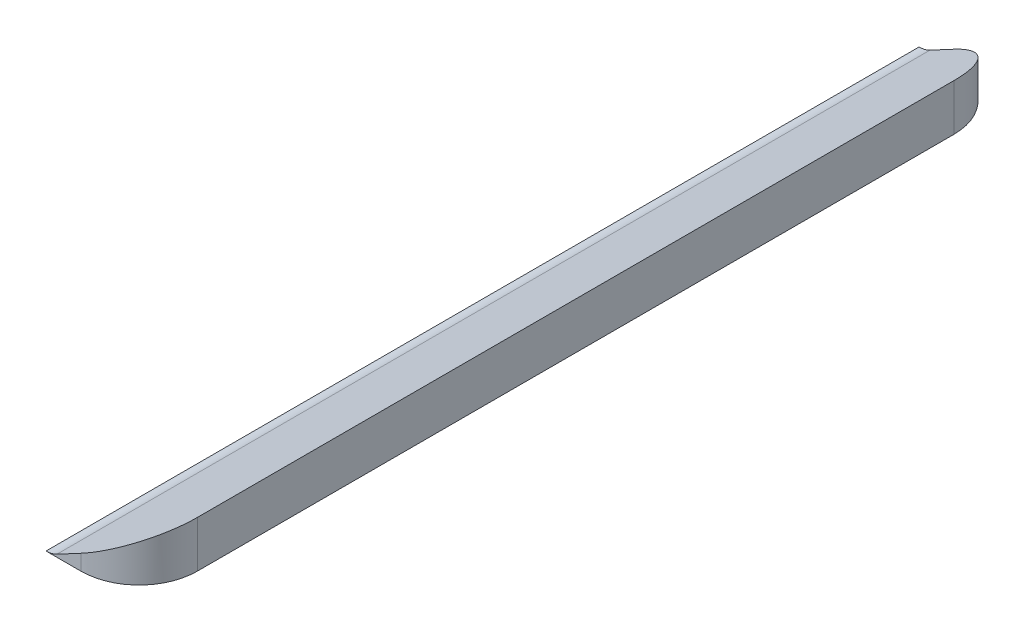
ISO-10303-21;
HEADER;
FILE_DESCRIPTION(('STEP AP214'),'2;1');
FILE_NAME('part.step','',(''),(''),'','','');
FILE_SCHEMA(('AUTOMOTIVE_DESIGN { 1 0 10303 214 1 1 1 1 }'));
ENDSEC;
DATA;
#1=APPLICATION_CONTEXT('core data for automotive mechanical design processes');
#2=APPLICATION_PROTOCOL_DEFINITION('international standard','automotive_design',2000,#1);
#3=PRODUCT_CONTEXT('',#1,'mechanical');
#4=PRODUCT('Part','Part','',(#3));
#5=PRODUCT_RELATED_PRODUCT_CATEGORY('part','',(#4));
#6=PRODUCT_DEFINITION_FORMATION('','',#4);
#7=PRODUCT_DEFINITION_CONTEXT('part definition',#1,'design');
#8=PRODUCT_DEFINITION('design','',#6,#7);
#9=PRODUCT_DEFINITION_SHAPE('','',#8);
#10=(LENGTH_UNIT() NAMED_UNIT(*) SI_UNIT(.MILLI.,.METRE.));
#11=(NAMED_UNIT(*) PLANE_ANGLE_UNIT() SI_UNIT($,.RADIAN.));
#12=(NAMED_UNIT(*) SI_UNIT($,.STERADIAN.) SOLID_ANGLE_UNIT());
#13=UNCERTAINTY_MEASURE_WITH_UNIT(LENGTH_MEASURE(1.E-05),#10,'distance_accuracy_value','');
#14=(GEOMETRIC_REPRESENTATION_CONTEXT(3) GLOBAL_UNCERTAINTY_ASSIGNED_CONTEXT((#13)) GLOBAL_UNIT_ASSIGNED_CONTEXT((#10,
#11,#12)) REPRESENTATION_CONTEXT('',''));
#15=CARTESIAN_POINT('',(0.,0.,0.));
#16=DIRECTION('',(0.,0.,1.));
#17=DIRECTION('',(1.,0.,0.));
#18=AXIS2_PLACEMENT_3D('',#15,#16,#17);
#19=CARTESIAN_POINT('',(0.,10.,-200.01));
#20=DIRECTION('',(0.,-1.,0.));
#21=DIRECTION('',(0.,0.,-1.));
#22=AXIS2_PLACEMENT_3D('',#19,#20,#21);
#23=PLANE('',#22);
#24=DIRECTION('',(-1.,0.,0.));
#25=VECTOR('',#24,1.);
#26=CARTESIAN_POINT('',(12.5,10.,-175.));
#27=LINE('',#26,#25);
#28=CARTESIAN_POINT('',(17.5,10.,-175.));
#29=VERTEX_POINT('',#28);
#30=CARTESIAN_POINT('',(11.5,10.,-175.));
#31=VERTEX_POINT('',#30);
#32=EDGE_CURVE('E99',#29,#31,#27,.T.);
#33=ORIENTED_EDGE('',*,*,#32,.F.);
#34=CARTESIAN_POINT('',(17.5,10.,-165.));
#35=DIRECTION('',(0.,-1.,0.));
#36=DIRECTION('',(0.,0.,-1.));
#37=AXIS2_PLACEMENT_3D('',#34,#35,#36);
#38=CIRCLE('',#37,10.);
#39=CARTESIAN_POINT('',(27.5,10.,-165.));
#40=VERTEX_POINT('',#39);
#41=EDGE_CURVE('E39',#29,#40,#38,.T.);
#42=ORIENTED_EDGE('',*,*,#41,.T.);
#43=DIRECTION('',(0.,0.,-1.));
#44=VECTOR('',#43,1.);
#45=CARTESIAN_POINT('',(27.5,10.,-175.));
#46=LINE('',#45,#44);
#47=CARTESIAN_POINT('',(27.5,10.,-35.));
#48=VERTEX_POINT('',#47);
#49=EDGE_CURVE('E129',#48,#40,#46,.T.);
#50=ORIENTED_EDGE('',*,*,#49,.F.);
#51=CARTESIAN_POINT('',(17.5,10.,-35.));
#52=DIRECTION('',(0.,-1.,0.));
#53=DIRECTION('',(0.,0.,-1.));
#54=AXIS2_PLACEMENT_3D('',#51,#52,#53);
#55=CIRCLE('',#54,10.);
#56=CARTESIAN_POINT('',(17.5,10.,-25.));
#57=VERTEX_POINT('',#56);
#58=EDGE_CURVE('E94',#48,#57,#55,.T.);
#59=ORIENTED_EDGE('',*,*,#58,.T.);
#60=DIRECTION('',(1.,0.,0.));
#61=VECTOR('',#60,1.);
#62=CARTESIAN_POINT('',(12.5,10.,-25.));
#63=LINE('',#62,#61);
#64=CARTESIAN_POINT('',(11.5,10.,-25.));
#65=VERTEX_POINT('',#64);
#66=EDGE_CURVE('E89',#65,#57,#63,.T.);
#67=ORIENTED_EDGE('',*,*,#66,.F.);
#68=DIRECTION('',(0.,0.,1.));
#69=VECTOR('',#68,1.);
#70=CARTESIAN_POINT('',(11.5,10.,-175.));
#71=LINE('',#70,#69);
#72=EDGE_CURVE('E91',#65,#31,#71,.F.);
#73=ORIENTED_EDGE('',*,*,#72,.T.);
#74=EDGE_LOOP('',(#33,#42,#50,#59,#67,#73));
#75=FACE_BOUND('',#74,.T.);
#76=ADVANCED_FACE('F36',(#75),#23,.T.);
#77=CARTESIAN_POINT('',(27.5,18.,-175.));
#78=DIRECTION('',(-1.,0.,0.));
#79=DIRECTION('',(0.,0.,1.));
#80=AXIS2_PLACEMENT_3D('',#77,#78,#79);
#81=PLANE('',#80);
#82=ORIENTED_EDGE('',*,*,#49,.T.);
#83=DIRECTION('',(0.,-1.,0.));
#84=VECTOR('',#83,1.);
#85=CARTESIAN_POINT('',(27.5,18.,-165.));
#86=LINE('',#85,#84);
#87=CARTESIAN_POINT('',(27.5,18.,-165.));
#88=VERTEX_POINT('',#87);
#89=EDGE_CURVE('E117',#40,#88,#86,.F.);
#90=ORIENTED_EDGE('',*,*,#89,.T.);
#91=DIRECTION('',(0.,0.,-1.));
#92=VECTOR('',#91,1.);
#93=CARTESIAN_POINT('',(27.5,18.,-175.));
#94=LINE('',#93,#92);
#95=CARTESIAN_POINT('',(27.5,18.,-35.));
#96=VERTEX_POINT('',#95);
#97=EDGE_CURVE('E52',#96,#88,#94,.T.);
#98=ORIENTED_EDGE('',*,*,#97,.F.);
#99=DIRECTION('',(0.,-1.,0.));
#100=VECTOR('',#99,1.);
#101=CARTESIAN_POINT('',(27.5,18.,-35.));
#102=LINE('',#101,#100);
#103=EDGE_CURVE('E120',#96,#48,#102,.T.);
#104=ORIENTED_EDGE('',*,*,#103,.T.);
#105=EDGE_LOOP('',(#82,#90,#98,#104));
#106=FACE_BOUND('',#105,.T.);
#107=ADVANCED_FACE('F139',(#106),#81,.F.);
#108=CARTESIAN_POINT('',(12.5,10.,-200.));
#109=DIRECTION('',(0.470588235294118,-0.882352941176471,0.));
#110=DIRECTION('',(0.882352941176471,0.470588235294118,0.));
#111=AXIS2_PLACEMENT_3D('',#108,#109,#110);
#112=PLANE('',#111);
#113=DIRECTION('',(0.882352941176471,0.470588235294118,0.));
#114=VECTOR('',#113,1.);
#115=CARTESIAN_POINT('',(15.8217993079585,11.7716262975778,-175.));
#116=LINE('',#115,#114);
#117=CARTESIAN_POINT('',(13.3823529411765,10.4705882352941,-175.));
#118=VERTEX_POINT('',#117);
#119=CARTESIAN_POINT('',(17.5,12.6666666666667,-175.));
#120=VERTEX_POINT('',#119);
#121=EDGE_CURVE('E127',#118,#120,#116,.T.);
#122=ORIENTED_EDGE('',*,*,#121,.F.);
#123=DIRECTION('',(0.,0.,1.));
#124=VECTOR('',#123,1.);
#125=CARTESIAN_POINT('',(13.3823529411765,10.4705882352941,-25.));
#126=LINE('',#125,#124);
#127=CARTESIAN_POINT('',(13.3823529411765,10.4705882352941,-25.));
#128=VERTEX_POINT('',#127);
#129=EDGE_CURVE('E109',#118,#128,#126,.T.);
#130=ORIENTED_EDGE('',*,*,#129,.T.);
#131=DIRECTION('',(-0.882352941176471,-0.470588235294118,0.));
#132=VECTOR('',#131,1.);
#133=CARTESIAN_POINT('',(15.8217993079585,11.7716262975779,-25.));
#134=LINE('',#133,#132);
#135=CARTESIAN_POINT('',(17.5,12.6666666666667,-25.));
#136=VERTEX_POINT('',#135);
#137=EDGE_CURVE('E12',#136,#128,#134,.T.);
#138=ORIENTED_EDGE('',*,*,#137,.F.);
#139=CARTESIAN_POINT('',(17.5,12.6666666666667,-35.));
#140=DIRECTION('',(0.470588235294118,-0.882352941176471,0.));
#141=DIRECTION('',(-0.882352941176471,-0.470588235294118,0.));
#142=AXIS2_PLACEMENT_3D('',#139,#140,#141);
#143=ELLIPSE('',#142,11.3333333333333,10.);
#144=EDGE_CURVE('E57',#136,#96,#143,.F.);
#145=ORIENTED_EDGE('',*,*,#144,.T.);
#146=ORIENTED_EDGE('',*,*,#97,.T.);
#147=CARTESIAN_POINT('',(17.5,12.6666666666667,-165.));
#148=DIRECTION('',(0.470588235294118,-0.882352941176471,0.));
#149=DIRECTION('',(-0.882352941176471,-0.470588235294118,0.));
#150=AXIS2_PLACEMENT_3D('',#147,#148,#149);
#151=ELLIPSE('',#150,11.3333333333333,10.);
#152=EDGE_CURVE('E44',#88,#120,#151,.F.);
#153=ORIENTED_EDGE('',*,*,#152,.T.);
#154=EDGE_LOOP('',(#122,#130,#138,#145,#146,#153));
#155=FACE_BOUND('',#154,.T.);
#156=ADVANCED_FACE('F153',(#155),#112,.F.);
#157=CARTESIAN_POINT('',(12.5,18.,-25.));
#158=DIRECTION('',(0.,0.,-1.));
#159=DIRECTION('',(-1.,0.,0.));
#160=AXIS2_PLACEMENT_3D('',#157,#158,#159);
#161=PLANE('',#160);
#162=DIRECTION('',(0.,-1.,0.));
#163=VECTOR('',#162,1.);
#164=CARTESIAN_POINT('',(17.5,18.,-25.));
#165=LINE('',#164,#163);
#166=EDGE_CURVE('E115',#57,#136,#165,.F.);
#167=ORIENTED_EDGE('',*,*,#166,.T.);
#168=ORIENTED_EDGE('',*,*,#137,.T.);
#169=CARTESIAN_POINT('',(11.5,14.,-25.));
#170=DIRECTION('',(0.,0.,-1.));
#171=DIRECTION('',(-1.,0.,0.));
#172=AXIS2_PLACEMENT_3D('',#169,#170,#171);
#173=CIRCLE('',#172,4.);
#174=EDGE_CURVE('E104',#128,#65,#173,.T.);
#175=ORIENTED_EDGE('',*,*,#174,.T.);
#176=ORIENTED_EDGE('',*,*,#66,.T.);
#177=EDGE_LOOP('',(#167,#168,#175,#176));
#178=FACE_BOUND('',#177,.T.);
#179=ADVANCED_FACE('F108',(#178),#161,.F.);
#180=CARTESIAN_POINT('',(12.5,18.,-175.));
#181=DIRECTION('',(0.,0.,1.));
#182=DIRECTION('',(1.,0.,0.));
#183=AXIS2_PLACEMENT_3D('',#180,#181,#182);
#184=PLANE('',#183);
#185=ORIENTED_EDGE('',*,*,#32,.T.);
#186=CARTESIAN_POINT('',(11.5,14.,-175.));
#187=DIRECTION('',(0.,0.,1.));
#188=DIRECTION('',(1.,0.,0.));
#189=AXIS2_PLACEMENT_3D('',#186,#187,#188);
#190=CIRCLE('',#189,4.);
#191=EDGE_CURVE('E106',#31,#118,#190,.T.);
#192=ORIENTED_EDGE('',*,*,#191,.T.);
#193=ORIENTED_EDGE('',*,*,#121,.T.);
#194=DIRECTION('',(0.,-1.,0.));
#195=VECTOR('',#194,1.);
#196=CARTESIAN_POINT('',(17.5,18.,-175.));
#197=LINE('',#196,#195);
#198=EDGE_CURVE('E123',#120,#29,#197,.T.);
#199=ORIENTED_EDGE('',*,*,#198,.T.);
#200=EDGE_LOOP('',(#185,#192,#193,#199));
#201=FACE_BOUND('',#200,.T.);
#202=ADVANCED_FACE('F150',(#201),#184,.F.);
#203=CARTESIAN_POINT('',(11.5,14.,-200.));
#204=DIRECTION('',(0.,0.,-1.));
#205=DIRECTION('',(-1.,0.,0.));
#206=AXIS2_PLACEMENT_3D('',#203,#204,#205);
#207=CYLINDRICAL_SURFACE('',#206,4.);
#208=ORIENTED_EDGE('',*,*,#191,.F.);
#209=ORIENTED_EDGE('',*,*,#72,.F.);
#210=ORIENTED_EDGE('',*,*,#174,.F.);
#211=ORIENTED_EDGE('',*,*,#129,.F.);
#212=EDGE_LOOP('',(#208,#209,#210,#211));
#213=FACE_BOUND('',#212,.T.);
#214=ADVANCED_FACE('F102',(#213),#207,.F.);
#215=CARTESIAN_POINT('',(17.5,18.,-35.));
#216=DIRECTION('',(0.,-1.,0.));
#217=DIRECTION('',(0.,0.,-1.));
#218=AXIS2_PLACEMENT_3D('',#215,#216,#217);
#219=CYLINDRICAL_SURFACE('',#218,10.);
#220=ORIENTED_EDGE('',*,*,#144,.F.);
#221=ORIENTED_EDGE('',*,*,#166,.F.);
#222=ORIENTED_EDGE('',*,*,#58,.F.);
#223=ORIENTED_EDGE('',*,*,#103,.F.);
#224=EDGE_LOOP('',(#220,#221,#222,#223));
#225=FACE_BOUND('',#224,.T.);
#226=ADVANCED_FACE('F142',(#225),#219,.T.);
#227=CARTESIAN_POINT('',(17.5,18.,-165.));
#228=DIRECTION('',(0.,-1.,0.));
#229=DIRECTION('',(0.,0.,-1.));
#230=AXIS2_PLACEMENT_3D('',#227,#228,#229);
#231=CYLINDRICAL_SURFACE('',#230,10.);
#232=ORIENTED_EDGE('',*,*,#152,.F.);
#233=ORIENTED_EDGE('',*,*,#89,.F.);
#234=ORIENTED_EDGE('',*,*,#41,.F.);
#235=ORIENTED_EDGE('',*,*,#198,.F.);
#236=EDGE_LOOP('',(#232,#233,#234,#235));
#237=FACE_BOUND('',#236,.T.);
#238=ADVANCED_FACE('F137',(#237),#231,.T.);
#239=CLOSED_SHELL('',(#76,#107,#156,#179,#202,#214,#226,#238));
#240=MANIFOLD_SOLID_BREP('B2',#239);
#241=ADVANCED_BREP_SHAPE_REPRESENTATION('',(#18,#240),#14);
#242=SHAPE_DEFINITION_REPRESENTATION(#9,#241);
ENDSEC;
END-ISO-10303-21;
